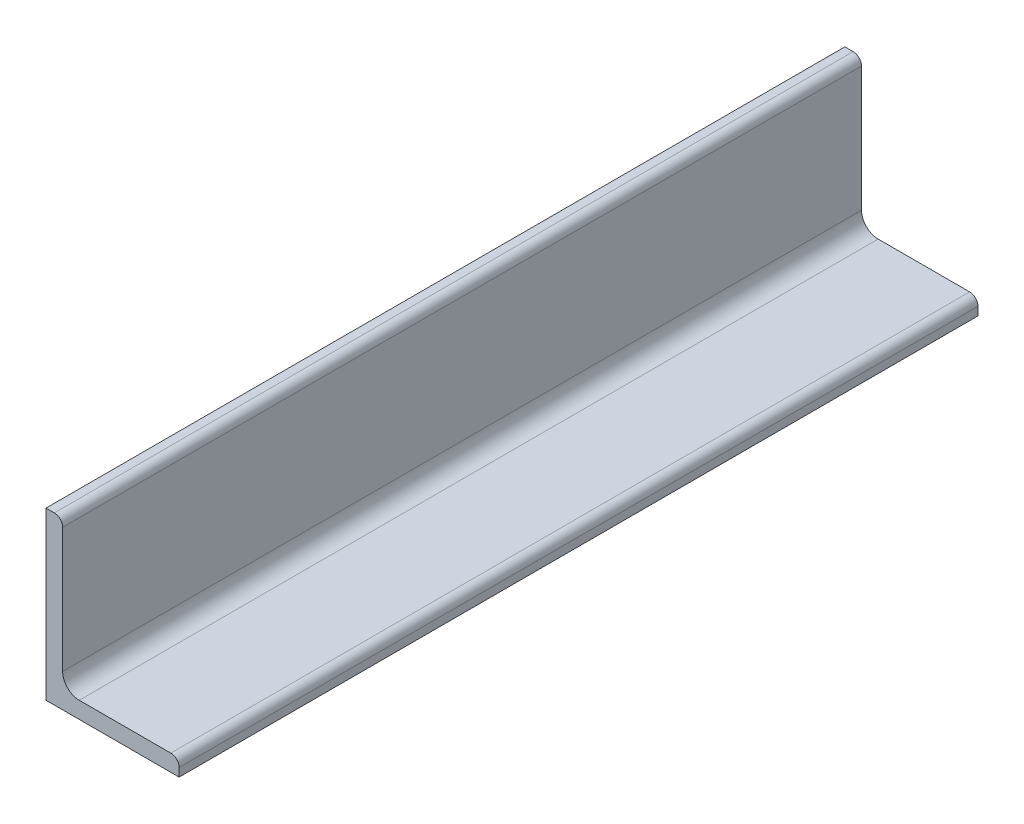
ISO-10303-21;
HEADER;
FILE_DESCRIPTION(('STEP AP214'),'2;1');
FILE_NAME('part.step','',(''),(''),'','','');
FILE_SCHEMA(('AUTOMOTIVE_DESIGN { 1 0 10303 214 1 1 1 1 }'));
ENDSEC;
DATA;
#1=APPLICATION_CONTEXT('core data for automotive mechanical design processes');
#2=APPLICATION_PROTOCOL_DEFINITION('international standard','automotive_design',2000,#1);
#3=PRODUCT_CONTEXT('',#1,'mechanical');
#4=PRODUCT('Part','Part','',(#3));
#5=PRODUCT_RELATED_PRODUCT_CATEGORY('part','',(#4));
#6=PRODUCT_DEFINITION_FORMATION('','',#4);
#7=PRODUCT_DEFINITION_CONTEXT('part definition',#1,'design');
#8=PRODUCT_DEFINITION('design','',#6,#7);
#9=PRODUCT_DEFINITION_SHAPE('','',#8);
#10=(LENGTH_UNIT() NAMED_UNIT(*) SI_UNIT(.MILLI.,.METRE.));
#11=(NAMED_UNIT(*) PLANE_ANGLE_UNIT() SI_UNIT($,.RADIAN.));
#12=(NAMED_UNIT(*) SI_UNIT($,.STERADIAN.) SOLID_ANGLE_UNIT());
#13=UNCERTAINTY_MEASURE_WITH_UNIT(LENGTH_MEASURE(1.E-05),#10,'distance_accuracy_value','');
#14=(GEOMETRIC_REPRESENTATION_CONTEXT(3) GLOBAL_UNCERTAINTY_ASSIGNED_CONTEXT((#13)) GLOBAL_UNIT_ASSIGNED_CONTEXT((#10,
#11,#12)) REPRESENTATION_CONTEXT('',''));
#15=CARTESIAN_POINT('',(0.,0.,0.));
#16=DIRECTION('',(0.,0.,1.));
#17=DIRECTION('',(1.,0.,0.));
#18=AXIS2_PLACEMENT_3D('',#15,#16,#17);
#19=CARTESIAN_POINT('',(0.116507760447575,63.8534276781816,304.8));
#20=DIRECTION('',(1.,0.,0.));
#21=DIRECTION('',(0.,0.,-1.));
#22=AXIS2_PLACEMENT_3D('',#19,#20,#21);
#23=PLANE('',#22);
#24=DIRECTION('',(0.,-1.,0.));
#25=VECTOR('',#24,1.);
#26=CARTESIAN_POINT('',(0.116507760447575,63.8534276781816,0.));
#27=LINE('',#26,#25);
#28=CARTESIAN_POINT('',(0.116507760447575,63.8534276781816,0.));
#29=VERTEX_POINT('',#28);
#30=CARTESIAN_POINT('',(0.116507760447575,0.353427678181561,0.));
#31=VERTEX_POINT('',#30);
#32=EDGE_CURVE('E135',#29,#31,#27,.T.);
#33=ORIENTED_EDGE('',*,*,#32,.T.);
#34=DIRECTION('',(0.,0.,-1.));
#35=VECTOR('',#34,1.);
#36=CARTESIAN_POINT('',(0.116507760447575,0.353427678181561,304.8));
#37=LINE('',#36,#35);
#38=CARTESIAN_POINT('',(0.116507760447575,0.353427678181561,304.8));
#39=VERTEX_POINT('',#38);
#40=EDGE_CURVE('E11',#39,#31,#37,.T.);
#41=ORIENTED_EDGE('',*,*,#40,.F.);
#42=DIRECTION('',(0.,-1.,0.));
#43=VECTOR('',#42,1.);
#44=CARTESIAN_POINT('',(0.116507760447575,63.8534276781816,304.8));
#45=LINE('',#44,#43);
#46=CARTESIAN_POINT('',(0.116507760447575,63.8534276781816,304.8));
#47=VERTEX_POINT('',#46);
#48=EDGE_CURVE('E151',#47,#39,#45,.T.);
#49=ORIENTED_EDGE('',*,*,#48,.F.);
#50=DIRECTION('',(0.,0.,-1.));
#51=VECTOR('',#50,1.);
#52=CARTESIAN_POINT('',(0.116507760447575,63.8534276781816,304.8));
#53=LINE('',#52,#51);
#54=EDGE_CURVE('E131',#47,#29,#53,.T.);
#55=ORIENTED_EDGE('',*,*,#54,.T.);
#56=EDGE_LOOP('',(#33,#41,#49,#55));
#57=FACE_BOUND('',#56,.T.);
#58=ADVANCED_FACE('F33',(#57),#23,.F.);
#59=CARTESIAN_POINT('',(0.116507760447575,0.353427678181561,304.8));
#60=DIRECTION('',(0.,1.,0.));
#61=DIRECTION('',(0.,0.,1.));
#62=AXIS2_PLACEMENT_3D('',#59,#60,#61);
#63=PLANE('',#62);
#64=DIRECTION('',(1.,0.,0.));
#65=VECTOR('',#64,1.);
#66=CARTESIAN_POINT('',(0.116507760447575,0.353427678181561,0.));
#67=LINE('',#66,#65);
#68=CARTESIAN_POINT('',(50.9165077604476,0.353427678181561,0.));
#69=VERTEX_POINT('',#68);
#70=EDGE_CURVE('E138',#31,#69,#67,.T.);
#71=ORIENTED_EDGE('',*,*,#70,.T.);
#72=DIRECTION('',(0.,0.,-1.));
#73=VECTOR('',#72,1.);
#74=CARTESIAN_POINT('',(50.9165077604476,0.353427678181561,304.8));
#75=LINE('',#74,#73);
#76=CARTESIAN_POINT('',(50.9165077604476,0.353427678181561,304.8));
#77=VERTEX_POINT('',#76);
#78=EDGE_CURVE('E41',#77,#69,#75,.T.);
#79=ORIENTED_EDGE('',*,*,#78,.F.);
#80=DIRECTION('',(1.,0.,0.));
#81=VECTOR('',#80,1.);
#82=CARTESIAN_POINT('',(0.116507760447575,0.353427678181561,304.8));
#83=LINE('',#82,#81);
#84=EDGE_CURVE('E95',#39,#77,#83,.T.);
#85=ORIENTED_EDGE('',*,*,#84,.F.);
#86=ORIENTED_EDGE('',*,*,#40,.T.);
#87=EDGE_LOOP('',(#71,#79,#85,#86));
#88=FACE_BOUND('',#87,.T.);
#89=ADVANCED_FACE('F194',(#88),#63,.F.);
#90=CARTESIAN_POINT('',(50.9165077604476,0.353427678181561,304.8));
#91=DIRECTION('',(-1.,0.,0.));
#92=DIRECTION('',(0.,0.,1.));
#93=AXIS2_PLACEMENT_3D('',#90,#91,#92);
#94=PLANE('',#93);
#95=DIRECTION('',(0.,1.,0.));
#96=VECTOR('',#95,1.);
#97=CARTESIAN_POINT('',(50.9165077604476,0.353427678181561,0.));
#98=LINE('',#97,#96);
#99=CARTESIAN_POINT('',(50.9165077604476,3.52842767818156,0.));
#100=VERTEX_POINT('',#99);
#101=EDGE_CURVE('E140',#69,#100,#98,.T.);
#102=ORIENTED_EDGE('',*,*,#101,.T.);
#103=DIRECTION('',(0.,0.,-1.));
#104=VECTOR('',#103,1.);
#105=CARTESIAN_POINT('',(50.9165077604476,3.52842767818156,304.8));
#106=LINE('',#105,#104);
#107=CARTESIAN_POINT('',(50.9165077604476,3.52842767818156,304.8));
#108=VERTEX_POINT('',#107);
#109=EDGE_CURVE('E161',#108,#100,#106,.T.);
#110=ORIENTED_EDGE('',*,*,#109,.F.);
#111=DIRECTION('',(0.,1.,0.));
#112=VECTOR('',#111,1.);
#113=CARTESIAN_POINT('',(50.9165077604476,0.353427678181561,304.8));
#114=LINE('',#113,#112);
#115=EDGE_CURVE('E169',#77,#108,#114,.T.);
#116=ORIENTED_EDGE('',*,*,#115,.F.);
#117=ORIENTED_EDGE('',*,*,#78,.T.);
#118=EDGE_LOOP('',(#102,#110,#116,#117));
#119=FACE_BOUND('',#118,.T.);
#120=ADVANCED_FACE('F167',(#119),#94,.F.);
#121=CARTESIAN_POINT('',(47.7415077604476,3.52842767818156,304.8));
#122=DIRECTION('',(0.,0.,-1.));
#123=DIRECTION('',(-1.,0.,0.));
#124=AXIS2_PLACEMENT_3D('',#121,#122,#123);
#125=CYLINDRICAL_SURFACE('',#124,3.175);
#126=CARTESIAN_POINT('',(47.7415077604476,3.52842767818156,0.));
#127=DIRECTION('',(0.,0.,1.));
#128=DIRECTION('',(1.,0.,0.));
#129=AXIS2_PLACEMENT_3D('',#126,#127,#128);
#130=CIRCLE('',#129,3.175);
#131=CARTESIAN_POINT('',(47.7415077604476,6.70342767818156,0.));
#132=VERTEX_POINT('',#131);
#133=EDGE_CURVE('E142',#100,#132,#130,.T.);
#134=ORIENTED_EDGE('',*,*,#133,.T.);
#135=DIRECTION('',(0.,0.,-1.));
#136=VECTOR('',#135,1.);
#137=CARTESIAN_POINT('',(47.7415077604476,6.70342767818156,304.8));
#138=LINE('',#137,#136);
#139=CARTESIAN_POINT('',(47.7415077604476,6.70342767818156,304.8));
#140=VERTEX_POINT('',#139);
#141=EDGE_CURVE('E158',#140,#132,#138,.T.);
#142=ORIENTED_EDGE('',*,*,#141,.F.);
#143=CARTESIAN_POINT('',(47.7415077604476,3.52842767818156,304.8));
#144=DIRECTION('',(0.,0.,1.));
#145=DIRECTION('',(1.,0.,0.));
#146=AXIS2_PLACEMENT_3D('',#143,#144,#145);
#147=CIRCLE('',#146,3.175);
#148=EDGE_CURVE('E185',#108,#140,#147,.T.);
#149=ORIENTED_EDGE('',*,*,#148,.F.);
#150=ORIENTED_EDGE('',*,*,#109,.T.);
#151=EDGE_LOOP('',(#134,#142,#149,#150));
#152=FACE_BOUND('',#151,.T.);
#153=ADVANCED_FACE('F178',(#152),#125,.T.);
#154=CARTESIAN_POINT('',(47.7415077604476,6.70342767818156,304.8));
#155=DIRECTION('',(0.,-1.,0.));
#156=DIRECTION('',(0.,0.,-1.));
#157=AXIS2_PLACEMENT_3D('',#154,#155,#156);
#158=PLANE('',#157);
#159=DIRECTION('',(-1.,0.,0.));
#160=VECTOR('',#159,1.);
#161=CARTESIAN_POINT('',(47.7415077604476,6.70342767818156,0.));
#162=LINE('',#161,#160);
#163=CARTESIAN_POINT('',(12.8165077604476,6.70342767818156,0.));
#164=VERTEX_POINT('',#163);
#165=EDGE_CURVE('E144',#132,#164,#162,.T.);
#166=ORIENTED_EDGE('',*,*,#165,.T.);
#167=DIRECTION('',(0.,0.,-1.));
#168=VECTOR('',#167,1.);
#169=CARTESIAN_POINT('',(12.8165077604476,6.70342767818156,304.8));
#170=LINE('',#169,#168);
#171=CARTESIAN_POINT('',(12.8165077604476,6.70342767818156,304.8));
#172=VERTEX_POINT('',#171);
#173=EDGE_CURVE('E155',#172,#164,#170,.T.);
#174=ORIENTED_EDGE('',*,*,#173,.F.);
#175=DIRECTION('',(-1.,0.,0.));
#176=VECTOR('',#175,1.);
#177=CARTESIAN_POINT('',(47.7415077604476,6.70342767818156,304.8));
#178=LINE('',#177,#176);
#179=EDGE_CURVE('E184',#140,#172,#178,.T.);
#180=ORIENTED_EDGE('',*,*,#179,.F.);
#181=ORIENTED_EDGE('',*,*,#141,.T.);
#182=EDGE_LOOP('',(#166,#174,#180,#181));
#183=FACE_BOUND('',#182,.T.);
#184=ADVANCED_FACE('F182',(#183),#158,.F.);
#185=CARTESIAN_POINT('',(12.8165077604476,13.0534276781816,304.8));
#186=DIRECTION('',(0.,0.,-1.));
#187=DIRECTION('',(-1.,0.,0.));
#188=AXIS2_PLACEMENT_3D('',#185,#186,#187);
#189=CYLINDRICAL_SURFACE('',#188,6.34999999999999);
#190=CARTESIAN_POINT('',(12.8165077604476,13.0534276781816,0.));
#191=DIRECTION('',(0.,0.,-1.));
#192=DIRECTION('',(1.,0.,0.));
#193=AXIS2_PLACEMENT_3D('',#190,#191,#192);
#194=CIRCLE('',#193,6.34999999999999);
#195=CARTESIAN_POINT('',(6.46650776044757,13.0534276781816,0.));
#196=VERTEX_POINT('',#195);
#197=EDGE_CURVE('E146',#164,#196,#194,.T.);
#198=ORIENTED_EDGE('',*,*,#197,.T.);
#199=DIRECTION('',(0.,0.,-1.));
#200=VECTOR('',#199,1.);
#201=CARTESIAN_POINT('',(6.46650776044757,13.0534276781816,304.8));
#202=LINE('',#201,#200);
#203=CARTESIAN_POINT('',(6.46650776044757,13.0534276781816,304.8));
#204=VERTEX_POINT('',#203);
#205=EDGE_CURVE('E126',#204,#196,#202,.T.);
#206=ORIENTED_EDGE('',*,*,#205,.F.);
#207=CARTESIAN_POINT('',(12.8165077604476,13.0534276781816,304.8));
#208=DIRECTION('',(0.,0.,-1.));
#209=DIRECTION('',(1.,0.,0.));
#210=AXIS2_PLACEMENT_3D('',#207,#208,#209);
#211=CIRCLE('',#210,6.34999999999999);
#212=EDGE_CURVE('E117',#172,#204,#211,.T.);
#213=ORIENTED_EDGE('',*,*,#212,.F.);
#214=ORIENTED_EDGE('',*,*,#173,.T.);
#215=EDGE_LOOP('',(#198,#206,#213,#214));
#216=FACE_BOUND('',#215,.T.);
#217=ADVANCED_FACE('F206',(#216),#189,.F.);
#218=CARTESIAN_POINT('',(6.46650776044757,13.0534276781816,304.8));
#219=DIRECTION('',(-1.,0.,0.));
#220=DIRECTION('',(0.,0.,1.));
#221=AXIS2_PLACEMENT_3D('',#218,#219,#220);
#222=PLANE('',#221);
#223=DIRECTION('',(0.,1.,0.));
#224=VECTOR('',#223,1.);
#225=CARTESIAN_POINT('',(6.46650776044757,13.0534276781816,0.));
#226=LINE('',#225,#224);
#227=CARTESIAN_POINT('',(6.46650776044757,60.6784276781816,0.));
#228=VERTEX_POINT('',#227);
#229=EDGE_CURVE('E125',#196,#228,#226,.T.);
#230=ORIENTED_EDGE('',*,*,#229,.T.);
#231=DIRECTION('',(0.,0.,-1.));
#232=VECTOR('',#231,1.);
#233=CARTESIAN_POINT('',(6.46650776044757,60.6784276781816,304.8));
#234=LINE('',#233,#232);
#235=CARTESIAN_POINT('',(6.46650776044757,60.6784276781816,304.8));
#236=VERTEX_POINT('',#235);
#237=EDGE_CURVE('E122',#236,#228,#234,.T.);
#238=ORIENTED_EDGE('',*,*,#237,.F.);
#239=DIRECTION('',(0.,1.,0.));
#240=VECTOR('',#239,1.);
#241=CARTESIAN_POINT('',(6.46650776044757,13.0534276781816,304.8));
#242=LINE('',#241,#240);
#243=EDGE_CURVE('E111',#204,#236,#242,.T.);
#244=ORIENTED_EDGE('',*,*,#243,.F.);
#245=ORIENTED_EDGE('',*,*,#205,.T.);
#246=EDGE_LOOP('',(#230,#238,#244,#245));
#247=FACE_BOUND('',#246,.T.);
#248=ADVANCED_FACE('F123',(#247),#222,.F.);
#249=CARTESIAN_POINT('',(3.29150776044757,60.6784276781816,304.8));
#250=DIRECTION('',(0.,0.,-1.));
#251=DIRECTION('',(-1.,0.,0.));
#252=AXIS2_PLACEMENT_3D('',#249,#250,#251);
#253=CYLINDRICAL_SURFACE('',#252,3.175);
#254=CARTESIAN_POINT('',(3.29150776044757,60.6784276781816,0.));
#255=DIRECTION('',(0.,0.,1.));
#256=DIRECTION('',(1.,0.,0.));
#257=AXIS2_PLACEMENT_3D('',#254,#255,#256);
#258=CIRCLE('',#257,3.175);
#259=CARTESIAN_POINT('',(3.29150776044758,63.8534276781816,0.));
#260=VERTEX_POINT('',#259);
#261=EDGE_CURVE('E81',#228,#260,#258,.T.);
#262=ORIENTED_EDGE('',*,*,#261,.T.);
#263=DIRECTION('',(0.,0.,-1.));
#264=VECTOR('',#263,1.);
#265=CARTESIAN_POINT('',(3.29150776044758,63.8534276781816,304.8));
#266=LINE('',#265,#264);
#267=CARTESIAN_POINT('',(3.29150776044758,63.8534276781816,304.8));
#268=VERTEX_POINT('',#267);
#269=EDGE_CURVE('E127',#268,#260,#266,.T.);
#270=ORIENTED_EDGE('',*,*,#269,.F.);
#271=CARTESIAN_POINT('',(3.29150776044757,60.6784276781816,304.8));
#272=DIRECTION('',(0.,0.,1.));
#273=DIRECTION('',(1.,0.,0.));
#274=AXIS2_PLACEMENT_3D('',#271,#272,#273);
#275=CIRCLE('',#274,3.175);
#276=EDGE_CURVE('E115',#236,#268,#275,.T.);
#277=ORIENTED_EDGE('',*,*,#276,.F.);
#278=ORIENTED_EDGE('',*,*,#237,.T.);
#279=EDGE_LOOP('',(#262,#270,#277,#278));
#280=FACE_BOUND('',#279,.T.);
#281=ADVANCED_FACE('F129',(#280),#253,.T.);
#282=CARTESIAN_POINT('',(3.29150776044758,63.8534276781816,304.8));
#283=DIRECTION('',(0.,-1.,0.));
#284=DIRECTION('',(0.,0.,-1.));
#285=AXIS2_PLACEMENT_3D('',#282,#283,#284);
#286=PLANE('',#285);
#287=DIRECTION('',(-1.,0.,0.));
#288=VECTOR('',#287,1.);
#289=CARTESIAN_POINT('',(3.29150776044758,63.8534276781816,0.));
#290=LINE('',#289,#288);
#291=EDGE_CURVE('E87',#260,#29,#290,.T.);
#292=ORIENTED_EDGE('',*,*,#291,.T.);
#293=ORIENTED_EDGE('',*,*,#54,.F.);
#294=DIRECTION('',(-1.,0.,0.));
#295=VECTOR('',#294,1.);
#296=CARTESIAN_POINT('',(3.29150776044758,63.8534276781816,304.8));
#297=LINE('',#296,#295);
#298=EDGE_CURVE('E49',#268,#47,#297,.T.);
#299=ORIENTED_EDGE('',*,*,#298,.F.);
#300=ORIENTED_EDGE('',*,*,#269,.T.);
#301=EDGE_LOOP('',(#292,#293,#299,#300));
#302=FACE_BOUND('',#301,.T.);
#303=ADVANCED_FACE('F214',(#302),#286,.F.);
#304=CARTESIAN_POINT('',(47.7415077604476,3.52842767818156,304.8));
#305=DIRECTION('',(0.,0.,1.));
#306=DIRECTION('',(1.,0.,0.));
#307=AXIS2_PLACEMENT_3D('',#304,#305,#306);
#308=PLANE('',#307);
#309=ORIENTED_EDGE('',*,*,#48,.T.);
#310=ORIENTED_EDGE('',*,*,#84,.T.);
#311=ORIENTED_EDGE('',*,*,#115,.T.);
#312=ORIENTED_EDGE('',*,*,#148,.T.);
#313=ORIENTED_EDGE('',*,*,#179,.T.);
#314=ORIENTED_EDGE('',*,*,#212,.T.);
#315=ORIENTED_EDGE('',*,*,#243,.T.);
#316=ORIENTED_EDGE('',*,*,#276,.T.);
#317=ORIENTED_EDGE('',*,*,#298,.T.);
#318=EDGE_LOOP('',(#309,#310,#311,#312,#313,#314,#315,#316,#317));
#319=FACE_BOUND('',#318,.T.);
#320=ADVANCED_FACE('F113',(#319),#308,.T.);
#321=CARTESIAN_POINT('',(47.7415077604476,3.52842767818156,0.));
#322=DIRECTION('',(0.,0.,1.));
#323=DIRECTION('',(1.,0.,0.));
#324=AXIS2_PLACEMENT_3D('',#321,#322,#323);
#325=PLANE('',#324);
#326=ORIENTED_EDGE('',*,*,#32,.F.);
#327=ORIENTED_EDGE('',*,*,#291,.F.);
#328=ORIENTED_EDGE('',*,*,#261,.F.);
#329=ORIENTED_EDGE('',*,*,#229,.F.);
#330=ORIENTED_EDGE('',*,*,#197,.F.);
#331=ORIENTED_EDGE('',*,*,#165,.F.);
#332=ORIENTED_EDGE('',*,*,#133,.F.);
#333=ORIENTED_EDGE('',*,*,#101,.F.);
#334=ORIENTED_EDGE('',*,*,#70,.F.);
#335=EDGE_LOOP('',(#326,#327,#328,#329,#330,#331,#332,#333,#334));
#336=FACE_BOUND('',#335,.T.);
#337=ADVANCED_FACE('F173',(#336),#325,.F.);
#338=CLOSED_SHELL('',(#58,#89,#120,#153,#184,#217,#248,#281,#303,#320,#337));
#339=MANIFOLD_SOLID_BREP('B2',#338);
#340=ADVANCED_BREP_SHAPE_REPRESENTATION('',(#18,#339),#14);
#341=SHAPE_DEFINITION_REPRESENTATION(#9,#340);
ENDSEC;
END-ISO-10303-21;
